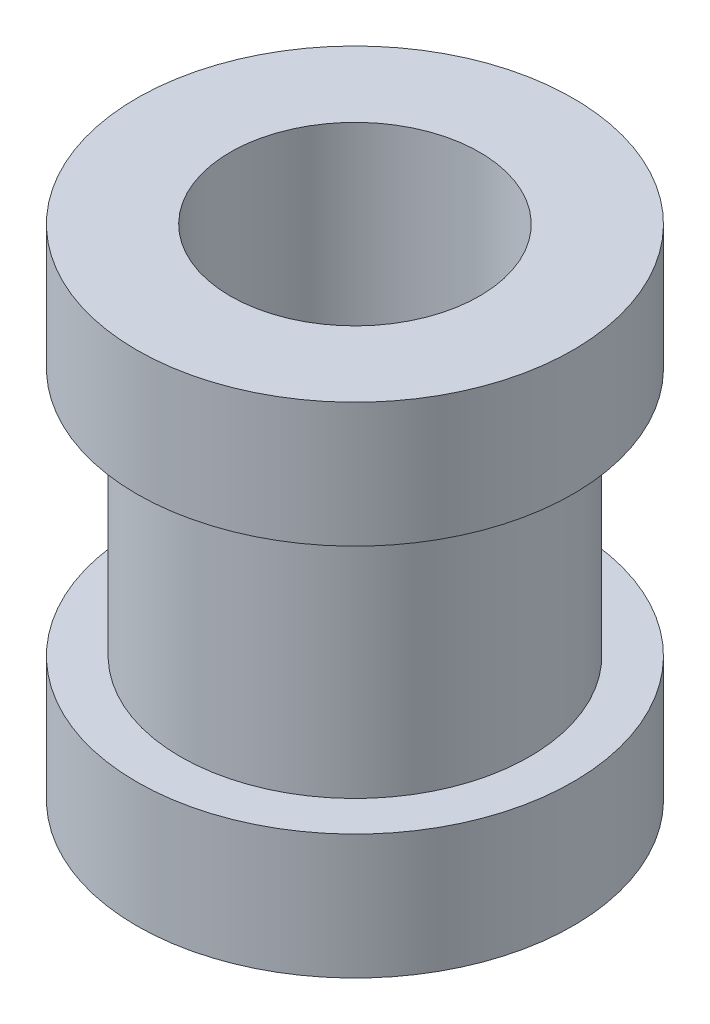
ISO-10303-21;
HEADER;
FILE_DESCRIPTION(('STEP AP214'),'2;1');
FILE_NAME('part.step','',(''),(''),'','','');
FILE_SCHEMA(('AUTOMOTIVE_DESIGN { 1 0 10303 214 1 1 1 1 }'));
ENDSEC;
DATA;
#1=APPLICATION_CONTEXT('core data for automotive mechanical design processes');
#2=APPLICATION_PROTOCOL_DEFINITION('international standard','automotive_design',2000,#1);
#3=PRODUCT_CONTEXT('',#1,'mechanical');
#4=PRODUCT('Part','Part','',(#3));
#5=PRODUCT_RELATED_PRODUCT_CATEGORY('part','',(#4));
#6=PRODUCT_DEFINITION_FORMATION('','',#4);
#7=PRODUCT_DEFINITION_CONTEXT('part definition',#1,'design');
#8=PRODUCT_DEFINITION('design','',#6,#7);
#9=PRODUCT_DEFINITION_SHAPE('','',#8);
#10=(LENGTH_UNIT() NAMED_UNIT(*) SI_UNIT(.MILLI.,.METRE.));
#11=(NAMED_UNIT(*) PLANE_ANGLE_UNIT() SI_UNIT($,.RADIAN.));
#12=(NAMED_UNIT(*) SI_UNIT($,.STERADIAN.) SOLID_ANGLE_UNIT());
#13=UNCERTAINTY_MEASURE_WITH_UNIT(LENGTH_MEASURE(1.E-05),#10,'distance_accuracy_value','');
#14=(GEOMETRIC_REPRESENTATION_CONTEXT(3) GLOBAL_UNCERTAINTY_ASSIGNED_CONTEXT((#13)) GLOBAL_UNIT_ASSIGNED_CONTEXT((#10,
#11,#12)) REPRESENTATION_CONTEXT('',''));
#15=CARTESIAN_POINT('',(0.,0.,0.));
#16=DIRECTION('',(0.,0.,1.));
#17=DIRECTION('',(1.,0.,0.));
#18=AXIS2_PLACEMENT_3D('',#15,#16,#17);
#19=CARTESIAN_POINT('',(0.,2.,0.));
#20=DIRECTION('',(0.,-1.,0.));
#21=DIRECTION('',(0.,0.,-1.));
#22=AXIS2_PLACEMENT_3D('',#19,#20,#21);
#23=CYLINDRICAL_SURFACE('',#22,1.4);
#24=CARTESIAN_POINT('',(0.,1.,0.));
#25=DIRECTION('',(0.,1.,0.));
#26=DIRECTION('',(0.,0.,1.));
#27=AXIS2_PLACEMENT_3D('',#24,#25,#26);
#28=CIRCLE('',#27,1.4);
#29=CARTESIAN_POINT('',(0.,1.,1.4));
#30=VERTEX_POINT('',#29);
#31=EDGE_CURVE('E40',#30,#30,#28,.T.);
#32=ORIENTED_EDGE('',*,*,#31,.F.);
#33=EDGE_LOOP('',(#32));
#34=FACE_BOUND('',#33,.T.);
#35=CARTESIAN_POINT('',(0.,-1.,0.));
#36=DIRECTION('',(0.,-1.,0.));
#37=DIRECTION('',(0.,0.,-1.));
#38=AXIS2_PLACEMENT_3D('',#35,#36,#37);
#39=CIRCLE('',#38,1.4);
#40=CARTESIAN_POINT('',(0.,-1.,-1.4));
#41=VERTEX_POINT('',#40);
#42=EDGE_CURVE('E10',#41,#41,#39,.T.);
#43=ORIENTED_EDGE('',*,*,#42,.F.);
#44=EDGE_LOOP('',(#43));
#45=FACE_BOUND('',#44,.T.);
#46=ADVANCED_FACE('F34',(#34,#45),#23,.T.);
#47=CARTESIAN_POINT('',(0.,1.,0.));
#48=DIRECTION('',(0.,1.,0.));
#49=DIRECTION('',(0.,0.,1.));
#50=AXIS2_PLACEMENT_3D('',#47,#48,#49);
#51=CYLINDRICAL_SURFACE('',#50,1.75);
#52=CARTESIAN_POINT('',(0.,1.,0.));
#53=DIRECTION('',(0.,1.,0.));
#54=DIRECTION('',(0.,0.,1.));
#55=AXIS2_PLACEMENT_3D('',#52,#53,#54);
#56=CIRCLE('',#55,1.75);
#57=CARTESIAN_POINT('',(0.,1.,1.75));
#58=VERTEX_POINT('',#57);
#59=EDGE_CURVE('E44',#58,#58,#56,.T.);
#60=ORIENTED_EDGE('',*,*,#59,.T.);
#61=EDGE_LOOP('',(#60));
#62=FACE_BOUND('',#61,.T.);
#63=CARTESIAN_POINT('',(0.,2.,0.));
#64=DIRECTION('',(0.,1.,0.));
#65=DIRECTION('',(0.,0.,1.));
#66=AXIS2_PLACEMENT_3D('',#63,#64,#65);
#67=CIRCLE('',#66,1.75);
#68=CARTESIAN_POINT('',(0.,2.,1.75));
#69=VERTEX_POINT('',#68);
#70=EDGE_CURVE('E48',#69,#69,#67,.T.);
#71=ORIENTED_EDGE('',*,*,#70,.F.);
#72=EDGE_LOOP('',(#71));
#73=FACE_BOUND('',#72,.T.);
#74=ADVANCED_FACE('F76',(#62,#73),#51,.T.);
#75=CARTESIAN_POINT('',(0.,1.,0.));
#76=DIRECTION('',(0.,1.,0.));
#77=DIRECTION('',(0.,0.,1.));
#78=AXIS2_PLACEMENT_3D('',#75,#76,#77);
#79=PLANE('',#78);
#80=ORIENTED_EDGE('',*,*,#31,.T.);
#81=EDGE_LOOP('',(#80));
#82=FACE_BOUND('',#81,.T.);
#83=ORIENTED_EDGE('',*,*,#59,.F.);
#84=EDGE_LOOP('',(#83));
#85=FACE_BOUND('',#84,.T.);
#86=ADVANCED_FACE('F72',(#82,#85),#79,.F.);
#87=CARTESIAN_POINT('',(0.,2.,0.));
#88=DIRECTION('',(0.,1.,0.));
#89=DIRECTION('',(0.,0.,1.));
#90=AXIS2_PLACEMENT_3D('',#87,#88,#89);
#91=PLANE('',#90);
#92=CARTESIAN_POINT('',(0.,2.,0.));
#93=DIRECTION('',(0.,1.,0.));
#94=DIRECTION('',(0.,0.,1.));
#95=AXIS2_PLACEMENT_3D('',#92,#93,#94);
#96=CIRCLE('',#95,1.);
#97=CARTESIAN_POINT('',(0.,2.,1.));
#98=VERTEX_POINT('',#97);
#99=EDGE_CURVE('E62',#98,#98,#96,.T.);
#100=ORIENTED_EDGE('',*,*,#99,.F.);
#101=EDGE_LOOP('',(#100));
#102=FACE_BOUND('',#101,.T.);
#103=ORIENTED_EDGE('',*,*,#70,.T.);
#104=EDGE_LOOP('',(#103));
#105=FACE_BOUND('',#104,.T.);
#106=ADVANCED_FACE('F68',(#102,#105),#91,.T.);
#107=CARTESIAN_POINT('',(0.,-1.,0.));
#108=DIRECTION('',(0.,-1.,0.));
#109=DIRECTION('',(0.,0.,-1.));
#110=AXIS2_PLACEMENT_3D('',#107,#108,#109);
#111=CYLINDRICAL_SURFACE('',#110,1.75);
#112=CARTESIAN_POINT('',(0.,-1.,0.));
#113=DIRECTION('',(0.,1.,0.));
#114=DIRECTION('',(0.,0.,1.));
#115=AXIS2_PLACEMENT_3D('',#112,#113,#114);
#116=CIRCLE('',#115,1.75);
#117=CARTESIAN_POINT('',(0.,-1.,1.75));
#118=VERTEX_POINT('',#117);
#119=EDGE_CURVE('E52',#118,#118,#116,.T.);
#120=ORIENTED_EDGE('',*,*,#119,.F.);
#121=EDGE_LOOP('',(#120));
#122=FACE_BOUND('',#121,.T.);
#123=CARTESIAN_POINT('',(0.,-2.,0.));
#124=DIRECTION('',(0.,1.,0.));
#125=DIRECTION('',(0.,0.,1.));
#126=AXIS2_PLACEMENT_3D('',#123,#124,#125);
#127=CIRCLE('',#126,1.75);
#128=CARTESIAN_POINT('',(0.,-2.,1.75));
#129=VERTEX_POINT('',#128);
#130=EDGE_CURVE('E54',#129,#129,#127,.T.);
#131=ORIENTED_EDGE('',*,*,#130,.T.);
#132=EDGE_LOOP('',(#131));
#133=FACE_BOUND('',#132,.T.);
#134=ADVANCED_FACE('F71',(#122,#133),#111,.T.);
#135=CARTESIAN_POINT('',(0.,-1.,0.));
#136=DIRECTION('',(0.,-1.,0.));
#137=DIRECTION('',(0.,0.,1.));
#138=AXIS2_PLACEMENT_3D('',#135,#136,#137);
#139=PLANE('',#138);
#140=ORIENTED_EDGE('',*,*,#42,.T.);
#141=EDGE_LOOP('',(#140));
#142=FACE_BOUND('',#141,.T.);
#143=ORIENTED_EDGE('',*,*,#119,.T.);
#144=EDGE_LOOP('',(#143));
#145=FACE_BOUND('',#144,.T.);
#146=ADVANCED_FACE('F89',(#142,#145),#139,.F.);
#147=CARTESIAN_POINT('',(0.,-2.,0.));
#148=DIRECTION('',(0.,1.,0.));
#149=DIRECTION('',(0.,0.,1.));
#150=AXIS2_PLACEMENT_3D('',#147,#148,#149);
#151=PLANE('',#150);
#152=CARTESIAN_POINT('',(0.,-2.,0.));
#153=DIRECTION('',(0.,1.,0.));
#154=DIRECTION('',(0.,0.,1.));
#155=AXIS2_PLACEMENT_3D('',#152,#153,#154);
#156=CIRCLE('',#155,1.);
#157=CARTESIAN_POINT('',(0.,-2.,1.));
#158=VERTEX_POINT('',#157);
#159=EDGE_CURVE('E57',#158,#158,#156,.T.);
#160=ORIENTED_EDGE('',*,*,#159,.T.);
#161=EDGE_LOOP('',(#160));
#162=FACE_BOUND('',#161,.T.);
#163=ORIENTED_EDGE('',*,*,#130,.F.);
#164=EDGE_LOOP('',(#163));
#165=FACE_BOUND('',#164,.T.);
#166=ADVANCED_FACE('F87',(#162,#165),#151,.F.);
#167=CARTESIAN_POINT('',(0.,-2.,0.));
#168=DIRECTION('',(0.,1.,0.));
#169=DIRECTION('',(0.,0.,1.));
#170=AXIS2_PLACEMENT_3D('',#167,#168,#169);
#171=CYLINDRICAL_SURFACE('',#170,1.);
#172=ORIENTED_EDGE('',*,*,#159,.F.);
#173=EDGE_LOOP('',(#172));
#174=FACE_BOUND('',#173,.T.);
#175=ORIENTED_EDGE('',*,*,#99,.T.);
#176=EDGE_LOOP('',(#175));
#177=FACE_BOUND('',#176,.T.);
#178=ADVANCED_FACE('F66',(#174,#177),#171,.F.);
#179=CLOSED_SHELL('',(#46,#74,#86,#106,#134,#146,#166,#178));
#180=MANIFOLD_SOLID_BREP('B2',#179);
#181=ADVANCED_BREP_SHAPE_REPRESENTATION('',(#18,#180),#14);
#182=SHAPE_DEFINITION_REPRESENTATION(#9,#181);
ENDSEC;
END-ISO-10303-21;
